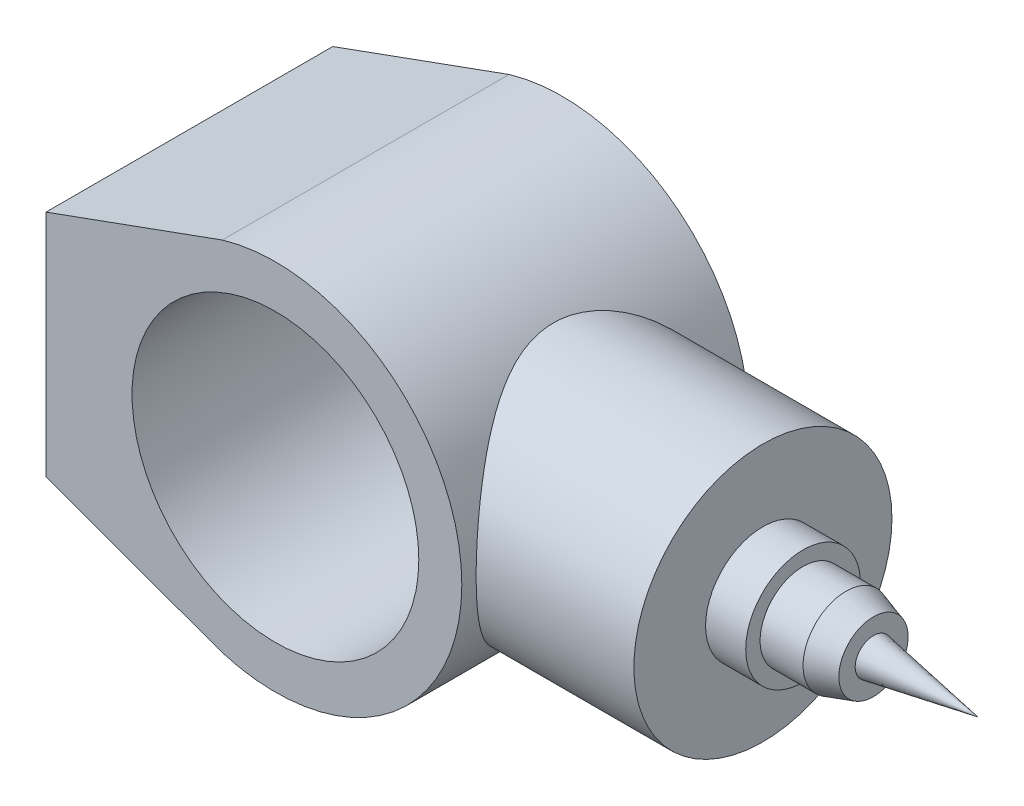
ISO-10303-21;
HEADER;
FILE_DESCRIPTION(('STEP AP214'),'2;1');
FILE_NAME('part.step','',(''),(''),'','','');
FILE_SCHEMA(('AUTOMOTIVE_DESIGN { 1 0 10303 214 1 1 1 1 }'));
ENDSEC;
DATA;
#1=APPLICATION_CONTEXT('core data for automotive mechanical design processes');
#2=APPLICATION_PROTOCOL_DEFINITION('international standard','automotive_design',2000,#1);
#3=PRODUCT_CONTEXT('',#1,'mechanical');
#4=PRODUCT('Part','Part','',(#3));
#5=PRODUCT_RELATED_PRODUCT_CATEGORY('part','',(#4));
#6=PRODUCT_DEFINITION_FORMATION('','',#4);
#7=PRODUCT_DEFINITION_CONTEXT('part definition',#1,'design');
#8=PRODUCT_DEFINITION('design','',#6,#7);
#9=PRODUCT_DEFINITION_SHAPE('','',#8);
#10=(LENGTH_UNIT() NAMED_UNIT(*) SI_UNIT(.MILLI.,.METRE.));
#11=(NAMED_UNIT(*) PLANE_ANGLE_UNIT() SI_UNIT($,.RADIAN.));
#12=(NAMED_UNIT(*) SI_UNIT($,.STERADIAN.) SOLID_ANGLE_UNIT());
#13=UNCERTAINTY_MEASURE_WITH_UNIT(LENGTH_MEASURE(1.E-05),#10,'distance_accuracy_value','');
#14=(GEOMETRIC_REPRESENTATION_CONTEXT(3) GLOBAL_UNCERTAINTY_ASSIGNED_CONTEXT((#13)) GLOBAL_UNIT_ASSIGNED_CONTEXT((#10,
#11,#12)) REPRESENTATION_CONTEXT('',''));
#15=CARTESIAN_POINT('',(0.,0.,0.));
#16=DIRECTION('',(0.,0.,1.));
#17=DIRECTION('',(1.,0.,0.));
#18=AXIS2_PLACEMENT_3D('',#15,#16,#17);
#19=CARTESIAN_POINT('',(0.,0.,50.));
#20=DIRECTION('',(0.,0.,1.));
#21=DIRECTION('',(1.,0.,0.));
#22=AXIS2_PLACEMENT_3D('',#19,#20,#21);
#23=PLANE('',#22);
#24=DIRECTION('',(-0.940044222342616,-0.341052576650971,0.));
#25=VECTOR('',#24,1.);
#26=CARTESIAN_POINT('',(-80.,40.,50.));
#27=LINE('',#26,#25);
#28=CARTESIAN_POINT('',(-18.5118551653975,62.3081954347528,50.));
#29=VERTEX_POINT('',#28);
#30=CARTESIAN_POINT('',(-80.,40.,50.));
#31=VERTEX_POINT('',#30);
#32=EDGE_CURVE('E182',#29,#31,#27,.T.);
#33=ORIENTED_EDGE('',*,*,#32,.T.);
#34=DIRECTION('',(0.,-1.,0.));
#35=VECTOR('',#34,1.);
#36=CARTESIAN_POINT('',(-80.,-40.,50.));
#37=LINE('',#36,#35);
#38=CARTESIAN_POINT('',(-80.,-40.,50.));
#39=VERTEX_POINT('',#38);
#40=EDGE_CURVE('E84',#31,#39,#37,.T.);
#41=ORIENTED_EDGE('',*,*,#40,.T.);
#42=DIRECTION('',(0.940044222342616,-0.341052576650971,0.));
#43=VECTOR('',#42,1.);
#44=CARTESIAN_POINT('',(-80.,-40.,50.));
#45=LINE('',#44,#43);
#46=CARTESIAN_POINT('',(-18.5118551653975,-62.3081954347528,50.));
#47=VERTEX_POINT('',#46);
#48=EDGE_CURVE('E178',#39,#47,#45,.T.);
#49=ORIENTED_EDGE('',*,*,#48,.T.);
#50=CARTESIAN_POINT('',(0.,0.,50.));
#51=DIRECTION('',(0.,0.,1.));
#52=DIRECTION('',(1.,0.,0.));
#53=AXIS2_PLACEMENT_3D('',#50,#51,#52);
#54=CIRCLE('',#53,65.);
#55=EDGE_CURVE('E53',#47,#29,#54,.T.);
#56=ORIENTED_EDGE('',*,*,#55,.T.);
#57=EDGE_LOOP('',(#33,#41,#49,#56));
#58=FACE_BOUND('',#57,.T.);
#59=CARTESIAN_POINT('',(0.,0.,50.));
#60=DIRECTION('',(0.,0.,1.));
#61=DIRECTION('',(1.,0.,0.));
#62=AXIS2_PLACEMENT_3D('',#59,#60,#61);
#63=CIRCLE('',#62,50.);
#64=CARTESIAN_POINT('',(50.,0.,50.));
#65=VERTEX_POINT('',#64);
#66=EDGE_CURVE('E192',#65,#65,#63,.T.);
#67=ORIENTED_EDGE('',*,*,#66,.F.);
#68=EDGE_LOOP('',(#67));
#69=FACE_BOUND('',#68,.T.);
#70=ADVANCED_FACE('F36',(#58,#69),#23,.T.);
#71=CARTESIAN_POINT('',(0.,0.,-50.));
#72=DIRECTION('',(0.,0.,1.));
#73=DIRECTION('',(1.,0.,0.));
#74=AXIS2_PLACEMENT_3D('',#71,#72,#73);
#75=PLANE('',#74);
#76=DIRECTION('',(-0.940044222342616,-0.341052576650971,0.));
#77=VECTOR('',#76,1.);
#78=CARTESIAN_POINT('',(-80.,40.,-50.));
#79=LINE('',#78,#77);
#80=CARTESIAN_POINT('',(-18.5118551653975,62.3081954347528,-50.));
#81=VERTEX_POINT('',#80);
#82=CARTESIAN_POINT('',(-80.,40.,-50.));
#83=VERTEX_POINT('',#82);
#84=EDGE_CURVE('E176',#81,#83,#79,.T.);
#85=ORIENTED_EDGE('',*,*,#84,.F.);
#86=CARTESIAN_POINT('',(0.,0.,-50.));
#87=DIRECTION('',(0.,0.,1.));
#88=DIRECTION('',(1.,0.,0.));
#89=AXIS2_PLACEMENT_3D('',#86,#87,#88);
#90=CIRCLE('',#89,65.);
#91=CARTESIAN_POINT('',(-18.5118551653975,-62.3081954347528,-50.));
#92=VERTEX_POINT('',#91);
#93=EDGE_CURVE('E77',#92,#81,#90,.T.);
#94=ORIENTED_EDGE('',*,*,#93,.F.);
#95=DIRECTION('',(0.940044222342616,-0.341052576650971,0.));
#96=VECTOR('',#95,1.);
#97=CARTESIAN_POINT('',(-80.,-40.,-50.));
#98=LINE('',#97,#96);
#99=CARTESIAN_POINT('',(-80.,-40.,-50.));
#100=VERTEX_POINT('',#99);
#101=EDGE_CURVE('E71',#100,#92,#98,.T.);
#102=ORIENTED_EDGE('',*,*,#101,.F.);
#103=DIRECTION('',(0.,-1.,0.));
#104=VECTOR('',#103,1.);
#105=CARTESIAN_POINT('',(-80.,-40.,-50.));
#106=LINE('',#105,#104);
#107=EDGE_CURVE('E171',#83,#100,#106,.T.);
#108=ORIENTED_EDGE('',*,*,#107,.F.);
#109=EDGE_LOOP('',(#85,#94,#102,#108));
#110=FACE_BOUND('',#109,.T.);
#111=CARTESIAN_POINT('',(0.,0.,-50.));
#112=DIRECTION('',(0.,0.,1.));
#113=DIRECTION('',(1.,0.,0.));
#114=AXIS2_PLACEMENT_3D('',#111,#112,#113);
#115=CIRCLE('',#114,50.);
#116=CARTESIAN_POINT('',(50.,0.,-50.));
#117=VERTEX_POINT('',#116);
#118=EDGE_CURVE('E194',#117,#117,#115,.T.);
#119=ORIENTED_EDGE('',*,*,#118,.T.);
#120=EDGE_LOOP('',(#119));
#121=FACE_BOUND('',#120,.T.);
#122=ADVANCED_FACE('F151',(#110,#121),#75,.F.);
#123=CARTESIAN_POINT('',(-80.,40.,50.));
#124=DIRECTION('',(0.341052576650971,-0.940044222342616,0.));
#125=DIRECTION('',(0.940044222342616,0.341052576650971,0.));
#126=AXIS2_PLACEMENT_3D('',#123,#124,#125);
#127=PLANE('',#126);
#128=ORIENTED_EDGE('',*,*,#84,.T.);
#129=DIRECTION('',(0.,0.,-1.));
#130=VECTOR('',#129,1.);
#131=CARTESIAN_POINT('',(-80.,40.,50.));
#132=LINE('',#131,#130);
#133=EDGE_CURVE('E11',#31,#83,#132,.T.);
#134=ORIENTED_EDGE('',*,*,#133,.F.);
#135=ORIENTED_EDGE('',*,*,#32,.F.);
#136=DIRECTION('',(0.,0.,-1.));
#137=VECTOR('',#136,1.);
#138=CARTESIAN_POINT('',(-18.5118551653975,62.3081954347528,50.));
#139=LINE('',#138,#137);
#140=EDGE_CURVE('E186',#29,#81,#139,.T.);
#141=ORIENTED_EDGE('',*,*,#140,.T.);
#142=EDGE_LOOP('',(#128,#134,#135,#141));
#143=FACE_BOUND('',#142,.T.);
#144=ADVANCED_FACE('F38',(#143),#127,.F.);
#145=CARTESIAN_POINT('',(-80.,-40.,50.));
#146=DIRECTION('',(1.,0.,0.));
#147=DIRECTION('',(0.,0.,-1.));
#148=AXIS2_PLACEMENT_3D('',#145,#146,#147);
#149=PLANE('',#148);
#150=ORIENTED_EDGE('',*,*,#107,.T.);
#151=DIRECTION('',(0.,0.,-1.));
#152=VECTOR('',#151,1.);
#153=CARTESIAN_POINT('',(-80.,-40.,50.));
#154=LINE('',#153,#152);
#155=EDGE_CURVE('E45',#39,#100,#154,.T.);
#156=ORIENTED_EDGE('',*,*,#155,.F.);
#157=ORIENTED_EDGE('',*,*,#40,.F.);
#158=ORIENTED_EDGE('',*,*,#133,.T.);
#159=EDGE_LOOP('',(#150,#156,#157,#158));
#160=FACE_BOUND('',#159,.T.);
#161=ADVANCED_FACE('F165',(#160),#149,.F.);
#162=CARTESIAN_POINT('',(-80.,-40.,50.));
#163=DIRECTION('',(0.341052576650971,0.940044222342616,0.));
#164=DIRECTION('',(-0.940044222342616,0.341052576650971,0.));
#165=AXIS2_PLACEMENT_3D('',#162,#163,#164);
#166=PLANE('',#165);
#167=ORIENTED_EDGE('',*,*,#101,.T.);
#168=DIRECTION('',(0.,0.,-1.));
#169=VECTOR('',#168,1.);
#170=CARTESIAN_POINT('',(-18.5118551653975,-62.3081954347528,50.));
#171=LINE('',#170,#169);
#172=EDGE_CURVE('E179',#47,#92,#171,.T.);
#173=ORIENTED_EDGE('',*,*,#172,.F.);
#174=ORIENTED_EDGE('',*,*,#48,.F.);
#175=ORIENTED_EDGE('',*,*,#155,.T.);
#176=EDGE_LOOP('',(#167,#173,#174,#175));
#177=FACE_BOUND('',#176,.T.);
#178=ADVANCED_FACE('F162',(#177),#166,.F.);
#179=CARTESIAN_POINT('',(0.,0.,50.));
#180=DIRECTION('',(0.,0.,-1.));
#181=DIRECTION('',(-1.,0.,0.));
#182=AXIS2_PLACEMENT_3D('',#179,#180,#181);
#183=CYLINDRICAL_SURFACE('',#182,65.);
#184=CARTESIAN_POINT('',(65.,0.,-45.));
#185=CARTESIAN_POINT('',(65.0000011696057,1.12147330120565,-45.0000012025283));
#186=CARTESIAN_POINT('',(64.9709159765212,2.24292945230778,-44.9580201602482));
#187=CARTESIAN_POINT('',(64.8553068641383,4.47658414079082,-44.790785609369));
#188=CARTESIAN_POINT('',(64.7687842573088,5.58878288911931,-44.6655340035371));
#189=CARTESIAN_POINT('',(64.5403785763001,7.79555151848628,-44.3336771879691));
#190=CARTESIAN_POINT('',(64.3984760503456,8.89011506447751,-44.1270433931238));
#191=CARTESIAN_POINT('',(64.0626457436966,11.0533096019768,-43.6354760134034));
#192=CARTESIAN_POINT('',(63.8687169569864,12.1219400915896,-43.3505409144375));
#193=CARTESIAN_POINT('',(63.4342222744662,14.2212125160505,-42.7078017297046));
#194=CARTESIAN_POINT('',(63.1938918545645,15.2520162370063,-42.3503651251477));
#195=CARTESIAN_POINT('',(62.6709259446924,17.2756280115286,-41.5659763086892));
#196=CARTESIAN_POINT('',(62.3882907364915,18.268436318107,-41.1390245597888));
#197=CARTESIAN_POINT('',(61.786108553932,20.2116697228795,-40.2199419970838));
#198=CARTESIAN_POINT('',(61.4665619062631,21.1620951960855,-39.7278117601444));
#199=CARTESIAN_POINT('',(60.7962171584065,23.0172309124314,-38.6825647509799));
#200=CARTESIAN_POINT('',(60.4454175300334,23.9219389167185,-38.1294449962195));
#201=CARTESIAN_POINT('',(59.6865648974474,25.7601880140228,-36.9151737617935));
#202=CARTESIAN_POINT('',(59.27618815402,26.6893215363404,-36.2488040005491));
#203=CARTESIAN_POINT('',(58.4330275057249,28.4880338622967,-34.8529502059224));
#204=CARTESIAN_POINT('',(58.0002425478181,29.3576098626539,-34.1234632053608));
#205=CARTESIAN_POINT('',(57.1195111836477,31.0364486388513,-32.6040251352403));
#206=CARTESIAN_POINT('',(56.6715447181891,31.8456267033451,-31.8139921794123));
#207=CARTESIAN_POINT('',(55.7691986061138,33.4006700551814,-30.1773036556993));
#208=CARTESIAN_POINT('',(55.3148185876119,34.1465316534289,-29.3306447936721));
#209=CARTESIAN_POINT('',(54.3303114345595,35.6959084068904,-27.4326466159468));
#210=CARTESIAN_POINT('',(53.8005937511269,36.4872853280241,-26.3711450656527));
#211=CARTESIAN_POINT('',(52.7593327891933,37.9773509509911,-24.17604025639));
#212=CARTESIAN_POINT('',(52.2477941160227,38.6760162868262,-23.0424189272517));
#213=CARTESIAN_POINT('',(51.2608149265043,39.9749077721744,-20.7072341856928));
#214=CARTESIAN_POINT('',(50.7853275075273,40.5752630453964,-19.5057627267967));
#215=CARTESIAN_POINT('',(49.8892399163793,41.6721166930025,-17.036931864064));
#216=CARTESIAN_POINT('',(49.4686114171658,42.1686687478853,-15.7696069409943));
#217=CARTESIAN_POINT('',(48.8208029416879,42.9149535309565,-13.5723996352816));
#218=CARTESIAN_POINT('',(48.5738420263557,43.1936925213245,-12.6581208440976));
#219=CARTESIAN_POINT('',(48.1238801744123,43.6944569649788,-10.8035389223551));
#220=CARTESIAN_POINT('',(47.9208721021929,43.9164916250901,-9.86324004407419));
#221=CARTESIAN_POINT('',(47.5660754926548,44.3005296261305,-7.96250438663409));
#222=CARTESIAN_POINT('',(47.4142038087044,44.4626304606427,-7.00210302149487));
#223=CARTESIAN_POINT('',(47.1671263845177,44.7246555122386,-5.06554052628518));
#224=CARTESIAN_POINT('',(47.0719206259529,44.824579749433,-4.08937940131224));
#225=CARTESIAN_POINT('',(46.9418899090943,44.9607388198673,-2.1232364847967));
#226=CARTESIAN_POINT('',(46.9073939345417,44.9966266570423,-1.13320851844658));
#227=CARTESIAN_POINT('',(46.9013571135476,45.0029190462422,0.847248377093852));
#228=CARTESIAN_POINT('',(46.9298161498631,44.9733237202183,1.837677305534));
#229=CARTESIAN_POINT('',(47.0484302849821,44.8492190899201,3.81128752429081));
#230=CARTESIAN_POINT('',(47.13862305521,44.7546701492421,4.79446401850661));
#231=CARTESIAN_POINT('',(47.3768313176079,44.5024241630868,6.74551496467455));
#232=CARTESIAN_POINT('',(47.5248480621437,44.3447257499009,7.71338908473168));
#233=CARTESIAN_POINT('',(47.8621764271841,43.9803320764262,9.56919366964684));
#234=CARTESIAN_POINT('',(48.0484149088864,43.7772163066585,10.4583970625519));
#235=CARTESIAN_POINT('',(48.4609441046406,43.32010640119,12.2144143492181));
#236=CARTESIAN_POINT('',(48.6872496045115,43.0660934784815,13.0812198417583));
#237=CARTESIAN_POINT('',(49.1738509640383,42.5096331932465,14.7898225666927));
#238=CARTESIAN_POINT('',(49.4341648638834,42.2071601049958,15.6316062329481));
#239=CARTESIAN_POINT('',(49.9825182796335,41.5563350032134,17.2876417419013));
#240=CARTESIAN_POINT('',(50.2705534011697,41.2079902580444,18.1018979206949));
#241=CARTESIAN_POINT('',(51.0225431471345,40.2767822129268,20.1137766396802));
#242=CARTESIAN_POINT('',(51.5007434523328,39.6654891440572,21.2930273345177));
#243=CARTESIAN_POINT('',(52.4891158781477,38.348029920852,23.5833678403921));
#244=CARTESIAN_POINT('',(52.9993005340589,37.6418264436726,24.6944305853524));
#245=CARTESIAN_POINT('',(54.0361557973494,36.1376496350166,26.8476775780095));
#246=CARTESIAN_POINT('',(54.5628535785461,35.3395185623559,27.8897384505711));
#247=CARTESIAN_POINT('',(55.6171804467178,33.6558443419671,29.8998791095632));
#248=CARTESIAN_POINT('',(56.1448094104418,32.7703120184234,30.8679680307498));
#249=CARTESIAN_POINT('',(57.1932449701135,30.9045304086319,32.7363921475659));
#250=CARTESIAN_POINT('',(57.7139191350983,29.9233731295192,33.6358963165067));
#251=CARTESIAN_POINT('',(58.7296419536465,27.8771206485979,35.350355349792));
#252=CARTESIAN_POINT('',(59.2246882700661,26.8120178135979,36.1653025097018));
#253=CARTESIAN_POINT('',(60.1756566955639,24.6035209522421,37.7024332048813));
#254=CARTESIAN_POINT('',(60.6316475651595,23.4602711709794,38.4247809320632));
#255=CARTESIAN_POINT('',(61.4931891608211,21.0989507187335,39.7703323765769));
#256=CARTESIAN_POINT('',(61.898755017873,19.8809026570889,40.3935658507715));
#257=CARTESIAN_POINT('',(62.5646802947783,17.6549035875762,41.4059204565395));
#258=CARTESIAN_POINT('',(62.8372982548467,16.6602403417733,41.8163120535009));
#259=CARTESIAN_POINT('',(63.3397164077328,14.6345031625144,42.5675669112335));
#260=CARTESIAN_POINT('',(63.569522535998,13.603434299959,42.9084398107234));
#261=CARTESIAN_POINT('',(63.9815049902596,11.5110112910016,43.5164676119118));
#262=CARTESIAN_POINT('',(64.1637052650743,10.4496726714621,43.7836595836378));
#263=CARTESIAN_POINT('',(64.476639865795,8.30296993183371,44.2409869387356));
#264=CARTESIAN_POINT('',(64.6073730982257,7.21760530180254,44.431120684921));
#265=CARTESIAN_POINT('',(64.8147345736682,5.02649787175023,44.7321113931983));
#266=CARTESIAN_POINT('',(64.8911534961694,3.92069290489763,44.8426616714377));
#267=CARTESIAN_POINT('',(64.9872183357685,1.70145350776208,44.981563734156));
#268=CARTESIAN_POINT('',(65.0068642771874,0.588019080747696,45.0099155538474));
#269=CARTESIAN_POINT('',(64.9889001241945,-1.63741781931566,44.9839662509349));
#270=CARTESIAN_POINT('',(64.9512898349751,-2.74942028747967,44.929664847113));
#271=CARTESIAN_POINT('',(64.819734418053,-4.96298947367603,44.7392747901952));
#272=CARTESIAN_POINT('',(64.7257910494465,-6.06455651648127,44.6031886909653));
#273=CARTESIAN_POINT('',(64.491175703309,-8.18254449212149,44.2620157992034));
#274=CARTESIAN_POINT('',(64.3536808680178,-9.20007959997774,44.0616107864454));
#275=CARTESIAN_POINT('',(64.0337856060908,-11.2121337136589,43.5930613516679));
#276=CARTESIAN_POINT('',(63.8513873855499,-12.2066538475799,43.3249202574929));
#277=CARTESIAN_POINT('',(63.4451725249075,-14.1673074608523,42.7239854011605));
#278=CARTESIAN_POINT('',(63.2213525684632,-15.1334386601223,42.3911864622047));
#279=CARTESIAN_POINT('',(62.736336352677,-17.0327019487273,41.6643868113868));
#280=CARTESIAN_POINT('',(62.4751380044848,-17.965832190203,41.2703826790343));
#281=CARTESIAN_POINT('',(61.8990085085122,-19.8637431772395,40.3931275129008));
#282=CARTESIAN_POINT('',(61.5815209528501,-20.8256806929253,39.9054081529014));
#283=CARTESIAN_POINT('',(60.9142086391395,-22.7035764997345,38.8677076181211));
#284=CARTESIAN_POINT('',(60.5643826081083,-23.6195329786528,38.3177239921568));
#285=CARTESIAN_POINT('',(59.8381347129401,-25.4032558353403,37.1592008079418));
#286=CARTESIAN_POINT('',(59.4616987975441,-26.270996314329,36.5506302507532));
#287=CARTESIAN_POINT('',(58.6884577670336,-27.9557544991496,35.2787474176625));
#288=CARTESIAN_POINT('',(58.2916515549571,-28.7727694681138,34.6154321925309));
#289=CARTESIAN_POINT('',(57.4151711853793,-30.4889708749912,33.1199200847161));
#290=CARTESIAN_POINT('',(56.9328754552547,-31.3785212006928,32.2781812569548));
#291=CARTESIAN_POINT('',(55.9590893109094,-33.0839042215169,30.5278352445589));
#292=CARTESIAN_POINT('',(55.4675975421249,-33.8997259516808,29.6192181500899));
#293=CARTESIAN_POINT('',(54.4860350387397,-35.45586994741,27.7375714933993));
#294=CARTESIAN_POINT('',(53.9959654596117,-36.1961418986443,26.7644997080007));
#295=CARTESIAN_POINT('',(53.0294834997435,-37.5978502361011,24.7568233036382));
#296=CARTESIAN_POINT('',(52.553069328415,-38.2592969946585,23.7222268074148));
#297=CARTESIAN_POINT('',(51.679941347726,-39.4291013564639,21.7149007388747));
#298=CARTESIAN_POINT('',(51.2803372484816,-39.9463152685162,20.7485884228094));
#299=CARTESIAN_POINT('',(50.5123974548912,-40.9130636661729,18.7705314851885));
#300=CARTESIAN_POINT('',(50.1440619804653,-41.3625976757848,17.7587865441704));
#301=CARTESIAN_POINT('',(49.4504928922364,-42.1893301292689,15.693797265063));
#302=CARTESIAN_POINT('',(49.1251906412473,-42.566644202947,14.6406225749502));
#303=CARTESIAN_POINT('',(48.5290098021012,-43.2451098617227,12.4950157035289));
#304=CARTESIAN_POINT('',(48.2581179989952,-43.5462799449171,11.4025931307277));
#305=CARTESIAN_POINT('',(47.8271610412375,-44.0186874861181,9.3921629994351));
#306=CARTESIAN_POINT('',(47.6558419905218,-44.2036946073207,8.47979353570419));
#307=CARTESIAN_POINT('',(47.3627606953031,-44.517583244497,6.63757582668245));
#308=CARTESIAN_POINT('',(47.2409923142224,-44.6464717105955,5.70772976070373));
#309=CARTESIAN_POINT('',(47.05166615705,-44.8459556683364,3.83718735816971));
#310=CARTESIAN_POINT('',(46.9840561376509,-44.9166073394187,2.89650236820514));
#311=CARTESIAN_POINT('',(46.9055698265682,-44.9985645522097,1.01014116515035));
#312=CARTESIAN_POINT('',(46.894694331428,-45.0098692606967,0.0644648821697862));
#313=CARTESIAN_POINT('',(46.9301408777119,-44.972908524549,-1.82506201386804));
#314=CARTESIAN_POINT('',(46.9764888551696,-44.9246160680299,-2.76891160474201));
#315=CARTESIAN_POINT('',(47.1245232303033,-44.7693052695385,-4.64731891289862));
#316=CARTESIAN_POINT('',(47.226209296244,-44.6622872796082,-5.58187668584874));
#317=CARTESIAN_POINT('',(47.4811423262629,-44.3911660407895,-7.43666598606561));
#318=CARTESIAN_POINT('',(47.634452919394,-44.2269923369625,-8.35687836049678));
#319=CARTESIAN_POINT('',(47.9871889035597,-43.8440109221367,-10.1768310643423));
#320=CARTESIAN_POINT('',(48.1866204648689,-43.6251959006593,-11.0765686368372));
#321=CARTESIAN_POINT('',(48.6908782922366,-43.0625185245671,-13.116726178063));
#322=CARTESIAN_POINT('',(49.0093972350599,-42.7008255731353,-14.2488681052183));
#323=CARTESIAN_POINT('',(49.699554494161,-41.8955268796886,-16.4668795226373));
#324=CARTESIAN_POINT('',(50.0712093704162,-41.4518955887103,-17.5527344499461));
#325=CARTESIAN_POINT('',(50.8544123719762,-40.4872212981013,-19.6760329984318));
#326=CARTESIAN_POINT('',(51.2660067549033,-39.9660881554129,-20.7134183727638));
#327=CARTESIAN_POINT('',(52.116211879306,-38.8508952329155,-22.7363587217865));
#328=CARTESIAN_POINT('',(52.5548209260535,-38.2568400254561,-23.7219169406072));
#329=CARTESIAN_POINT('',(53.4579357785502,-36.9847423381263,-25.6613286822633));
#330=CARTESIAN_POINT('',(53.9228021101371,-36.3051118639051,-26.6139712103077));
#331=CARTESIAN_POINT('',(54.8583333343946,-34.8753950985048,-28.4617532840731));
#332=CARTESIAN_POINT('',(55.3289982185488,-34.1253089107936,-29.3568929142368));
#333=CARTESIAN_POINT('',(56.2664339133503,-32.5564691651912,-31.0876310121466));
#334=CARTESIAN_POINT('',(56.7332035093429,-31.7376950080829,-31.923211478402));
#335=CARTESIAN_POINT('',(57.6535165855435,-30.033481652025,-33.5315189390535));
#336=CARTESIAN_POINT('',(58.1070588196762,-29.1480362003111,-34.3042400240121));
#337=CARTESIAN_POINT('',(59.0635284336244,-27.1643113596245,-35.9022819462667));
#338=CARTESIAN_POINT('',(59.5626106290919,-26.0547472869609,-36.7159606163356));
#339=CARTESIAN_POINT('',(60.5176757229357,-23.7521280348398,-38.2458641369291));
#340=CARTESIAN_POINT('',(60.9736519283074,-22.5590599397198,-38.962073861155));
#341=CARTESIAN_POINT('',(61.6149926579414,-20.7127348127311,-39.9558623322098));
#342=CARTESIAN_POINT('',(61.8215919655179,-20.088110583999,-40.2735888165198));
#343=CARTESIAN_POINT('',(62.2191547005856,-18.8206694867556,-40.8812436548858));
#344=CARTESIAN_POINT('',(62.4101203779565,-18.1778552539997,-41.1711760099034));
#345=CARTESIAN_POINT('',(62.7748527233683,-16.875283117665,-41.7219931318356));
#346=CARTESIAN_POINT('',(62.9486230408552,-16.2155288469421,-41.9828840638124));
#347=CARTESIAN_POINT('',(63.2775356475737,-14.8804011558233,-42.4744610119283));
#348=CARTESIAN_POINT('',(63.432679284421,-14.2050288695917,-42.7051492133046));
#349=CARTESIAN_POINT('',(63.8070721968101,-12.4447010544915,-43.25974494481));
#350=CARTESIAN_POINT('',(64.0114184468014,-11.3490405228654,-43.5602757498286));
#351=CARTESIAN_POINT('',(64.3654191982087,-9.12991345978806,-44.078827644396));
#352=CARTESIAN_POINT('',(64.5150820049425,-8.00645117856259,-44.2968612637911));
#353=CARTESIAN_POINT('',(64.7559993187061,-5.74082253729113,-44.6470112993716));
#354=CARTESIAN_POINT('',(64.847297757104,-4.59867091062173,-44.7791923387443));
#355=CARTESIAN_POINT('',(64.9692976296881,-2.30434018473195,-44.9556862638234));
#356=CARTESIAN_POINT('',(64.9999987983895,-1.15216104160189,-44.999998764566));
#357=CARTESIAN_POINT('',(65.,0.,-45.));
#358=B_SPLINE_CURVE_WITH_KNOTS('',3,(#184,#185,#186,#187,#188,#189,#190,#191,#192,#193,#194,
#195,#196,#197,#198,#199,#200,#201,#202,#203,#204,#205,#206,#207,#208,#209,#210,#211,#212,#213,
#214,#215,#216,#217,#218,#219,#220,#221,#222,#223,#224,#225,#226,#227,#228,#229,#230,#231,#232,
#233,#234,#235,#236,#237,#238,#239,#240,#241,#242,#243,#244,#245,#246,#247,#248,#249,#250,#251,
#252,#253,#254,#255,#256,#257,#258,#259,#260,#261,#262,#263,#264,#265,#266,#267,#268,#269,#270,
#271,#272,#273,#274,#275,#276,#277,#278,#279,#280,#281,#282,#283,#284,#285,#286,#287,#288,#289,
#290,#291,#292,#293,#294,#295,#296,#297,#298,#299,#300,#301,#302,#303,#304,#305,#306,#307,#308,
#309,#310,#311,#312,#313,#314,#315,#316,#317,#318,#319,#320,#321,#322,#323,#324,#325,#326,#327,
#328,#329,#330,#331,#332,#333,#334,#335,#336,#337,#338,#339,#340,#341,#342,#343,#344,#345,#346,
#347,#348,#349,#350,#351,#352,#353,#354,#355,#356,#357),.UNSPECIFIED.,.T.,.F.,(4,2,2,2,2,2,2,2,
2,2,2,2,2,2,2,2,2,2,2,2,2,2,2,2,2,2,2,2,2,2,2,2,2,2,2,2,2,2,2,2,2,2,2,2,2,2,2,2,2,2,2,2,2,2,2,2,
2,2,2,2,2,2,2,2,2,2,2,2,2,2,2,2,2,2,2,2,2,2,2,2,2,2,2,2,2,2,4),(0.,3.36323892794144,
6.72640100710137,10.0907454360665,13.4551549250109,16.8029195613731,20.1506619010729,
23.4983746134034,26.8462511096753,30.4871649037346,34.1282499524345,37.7743494260164,
41.4206611917409,45.6939383064405,49.9682903731881,54.2369825353392,58.5034617073671,
61.4625138492405,64.4210852373372,67.3748225577202,70.3285589227263,73.2982527376573,
76.2679410220407,79.2394430998938,82.2110095388412,85.0011411726389,87.7923045951578,
90.584954683776,93.3771628083065,97.6064034875675,101.837312178738,106.075592113262,
110.313347816192,114.596218662803,118.879479402292,123.155037051935,127.429308626693,
130.755998382163,134.082226580387,137.406778235214,140.731400520075,144.068767009318,
147.406132068879,150.743508483461,154.080780688207,157.215791533369,160.350648386749,
163.485756334407,166.621039552604,169.990545063149,173.360183268584,176.73161428665,
180.103227050672,184.047902440152,187.993163521895,191.94103513809,195.888386692538,
199.385185586645,202.88200907258,206.373186157811,209.863514294626,212.700365177753,
215.536864625513,218.370624567028,221.204424293963,224.039508887241,226.874576485218,
229.713151272815,232.55210603787,236.23803941247,239.925124033801,243.616531168718,
247.307706963636,251.081871120678,254.856029735252,258.631324277359,262.406973327354,
266.792058434818,271.177823293658,273.368885604935,275.55963203795,277.749912517597,
279.940034437727,283.398420446896,286.856280978073,290.31153567335,293.766805506531),.UNSPECIFIED.);
#359=CARTESIAN_POINT('',(65.,0.,-45.));
#360=VERTEX_POINT('',#359);
#361=EDGE_CURVE('E117',#360,#360,#358,.T.);
#362=ORIENTED_EDGE('',*,*,#361,.F.);
#363=EDGE_LOOP('',(#362));
#364=FACE_BOUND('',#363,.T.);
#365=ORIENTED_EDGE('',*,*,#93,.T.);
#366=ORIENTED_EDGE('',*,*,#140,.F.);
#367=ORIENTED_EDGE('',*,*,#55,.F.);
#368=ORIENTED_EDGE('',*,*,#172,.T.);
#369=EDGE_LOOP('',(#365,#366,#367,#368));
#370=FACE_BOUND('',#369,.T.);
#371=ADVANCED_FACE('F148',(#364,#370),#183,.T.);
#372=CARTESIAN_POINT('',(0.,0.,50.));
#373=DIRECTION('',(0.,0.,-1.));
#374=DIRECTION('',(-1.,0.,0.));
#375=AXIS2_PLACEMENT_3D('',#372,#373,#374);
#376=CYLINDRICAL_SURFACE('',#375,50.);
#377=ORIENTED_EDGE('',*,*,#66,.T.);
#378=EDGE_LOOP('',(#377));
#379=FACE_BOUND('',#378,.T.);
#380=ORIENTED_EDGE('',*,*,#118,.F.);
#381=EDGE_LOOP('',(#380));
#382=FACE_BOUND('',#381,.T.);
#383=ADVANCED_FACE('F138',(#379,#382),#376,.F.);
#384=CARTESIAN_POINT('',(-80.002,0.,0.));
#385=DIRECTION('',(1.,0.,0.));
#386=DIRECTION('',(0.,0.,-1.));
#387=AXIS2_PLACEMENT_3D('',#384,#385,#386);
#388=CYLINDRICAL_SURFACE('',#387,45.);
#389=CARTESIAN_POINT('',(120.,0.,0.));
#390=DIRECTION('',(1.,0.,0.));
#391=DIRECTION('',(0.,0.,-1.));
#392=AXIS2_PLACEMENT_3D('',#389,#390,#391);
#393=CIRCLE('',#392,45.);
#394=CARTESIAN_POINT('',(120.,0.,-45.));
#395=VERTEX_POINT('',#394);
#396=EDGE_CURVE('E125',#395,#395,#393,.T.);
#397=ORIENTED_EDGE('',*,*,#396,.F.);
#398=EDGE_LOOP('',(#397));
#399=FACE_BOUND('',#398,.T.);
#400=ORIENTED_EDGE('',*,*,#361,.T.);
#401=EDGE_LOOP('',(#400));
#402=FACE_BOUND('',#401,.T.);
#403=ADVANCED_FACE('F127',(#399,#402),#388,.T.);
#404=CARTESIAN_POINT('',(120.,0.,0.));
#405=DIRECTION('',(1.,0.,0.));
#406=DIRECTION('',(0.,0.,-1.));
#407=AXIS2_PLACEMENT_3D('',#404,#405,#406);
#408=PLANE('',#407);
#409=CARTESIAN_POINT('',(120.,0.,0.));
#410=DIRECTION('',(-1.,0.,0.));
#411=DIRECTION('',(0.,0.,1.));
#412=AXIS2_PLACEMENT_3D('',#409,#410,#411);
#413=CIRCLE('',#412,20.);
#414=CARTESIAN_POINT('',(120.,0.,20.));
#415=VERTEX_POINT('',#414);
#416=EDGE_CURVE('E114',#415,#415,#413,.T.);
#417=ORIENTED_EDGE('',*,*,#416,.T.);
#418=EDGE_LOOP('',(#417));
#419=FACE_BOUND('',#418,.T.);
#420=ORIENTED_EDGE('',*,*,#396,.T.);
#421=EDGE_LOOP('',(#420));
#422=FACE_BOUND('',#421,.T.);
#423=ADVANCED_FACE('F135',(#419,#422),#408,.T.);
#424=CARTESIAN_POINT('',(0.,0.,0.));
#425=DIRECTION('',(-1.,0.,0.));
#426=DIRECTION('',(0.,0.,1.));
#427=AXIS2_PLACEMENT_3D('',#424,#425,#426);
#428=CYLINDRICAL_SURFACE('',#427,20.);
#429=CARTESIAN_POINT('',(134.,0.,0.));
#430=DIRECTION('',(-1.,0.,0.));
#431=DIRECTION('',(0.,0.,1.));
#432=AXIS2_PLACEMENT_3D('',#429,#430,#431);
#433=CIRCLE('',#432,20.);
#434=CARTESIAN_POINT('',(134.,0.,20.));
#435=VERTEX_POINT('',#434);
#436=EDGE_CURVE('E111',#435,#435,#433,.T.);
#437=ORIENTED_EDGE('',*,*,#436,.T.);
#438=EDGE_LOOP('',(#437));
#439=FACE_BOUND('',#438,.T.);
#440=ORIENTED_EDGE('',*,*,#416,.F.);
#441=EDGE_LOOP('',(#440));
#442=FACE_BOUND('',#441,.T.);
#443=ADVANCED_FACE('F133',(#439,#442),#428,.T.);
#444=CARTESIAN_POINT('',(134.,-20.,0.));
#445=DIRECTION('',(1.,0.,0.));
#446=DIRECTION('',(0.,0.,-1.));
#447=AXIS2_PLACEMENT_3D('',#444,#445,#446);
#448=PLANE('',#447);
#449=CARTESIAN_POINT('',(134.,0.,0.));
#450=DIRECTION('',(-1.,0.,0.));
#451=DIRECTION('',(0.,0.,1.));
#452=AXIS2_PLACEMENT_3D('',#449,#450,#451);
#453=CIRCLE('',#452,15.);
#454=CARTESIAN_POINT('',(134.,0.,15.));
#455=VERTEX_POINT('',#454);
#456=EDGE_CURVE('E108',#455,#455,#453,.T.);
#457=ORIENTED_EDGE('',*,*,#456,.T.);
#458=EDGE_LOOP('',(#457));
#459=FACE_BOUND('',#458,.T.);
#460=ORIENTED_EDGE('',*,*,#436,.F.);
#461=EDGE_LOOP('',(#460));
#462=FACE_BOUND('',#461,.T.);
#463=ADVANCED_FACE('F143',(#459,#462),#448,.T.);
#464=CARTESIAN_POINT('',(0.,0.,0.));
#465=DIRECTION('',(-1.,0.,0.));
#466=DIRECTION('',(0.,0.,1.));
#467=AXIS2_PLACEMENT_3D('',#464,#465,#466);
#468=CYLINDRICAL_SURFACE('',#467,15.);
#469=CARTESIAN_POINT('',(149.,0.,0.));
#470=DIRECTION('',(-1.,0.,0.));
#471=DIRECTION('',(0.,0.,1.));
#472=AXIS2_PLACEMENT_3D('',#469,#470,#471);
#473=CIRCLE('',#472,15.);
#474=CARTESIAN_POINT('',(149.,0.,15.));
#475=VERTEX_POINT('',#474);
#476=EDGE_CURVE('E105',#475,#475,#473,.T.);
#477=ORIENTED_EDGE('',*,*,#476,.T.);
#478=EDGE_LOOP('',(#477));
#479=FACE_BOUND('',#478,.T.);
#480=ORIENTED_EDGE('',*,*,#456,.F.);
#481=EDGE_LOOP('',(#480));
#482=FACE_BOUND('',#481,.T.);
#483=ADVANCED_FACE('F263',(#479,#482),#468,.T.);
#484=CARTESIAN_POINT('',(149.,-15.,0.));
#485=DIRECTION('',(-1.,0.,0.));
#486=DIRECTION('',(0.,0.,1.));
#487=AXIS2_PLACEMENT_3D('',#484,#485,#486);
#488=PLANE('',#487);
#489=CARTESIAN_POINT('',(149.,0.,0.));
#490=DIRECTION('',(-1.,0.,0.));
#491=DIRECTION('',(0.,0.,1.));
#492=AXIS2_PLACEMENT_3D('',#489,#490,#491);
#493=CIRCLE('',#492,15.0222276850702);
#494=CARTESIAN_POINT('',(149.,0.,15.0222276850702));
#495=VERTEX_POINT('',#494);
#496=EDGE_CURVE('E100',#495,#495,#493,.T.);
#497=ORIENTED_EDGE('',*,*,#496,.T.);
#498=EDGE_LOOP('',(#497));
#499=FACE_BOUND('',#498,.T.);
#500=ORIENTED_EDGE('',*,*,#476,.F.);
#501=EDGE_LOOP('',(#500));
#502=FACE_BOUND('',#501,.T.);
#503=ADVANCED_FACE('F272',(#499,#502),#488,.T.);
#504=CARTESIAN_POINT('',(149.,0.,0.));
#505=DIRECTION('',(-1.,0.,0.));
#506=DIRECTION('',(0.,0.,1.));
#507=AXIS2_PLACEMENT_3D('',#504,#505,#506);
#508=CONICAL_SURFACE('',#507,15.0222276850702,0.299264512567771);
#509=CARTESIAN_POINT('',(158.555535821133,0.,0.));
#510=DIRECTION('',(-1.,0.,0.));
#511=DIRECTION('',(0.,0.,1.));
#512=AXIS2_PLACEMENT_3D('',#509,#510,#511);
#513=CIRCLE('',#512,12.0740527969325);
#514=CARTESIAN_POINT('',(158.555535821133,0.,12.0740527969325));
#515=VERTEX_POINT('',#514);
#516=EDGE_CURVE('E97',#515,#515,#513,.T.);
#517=ORIENTED_EDGE('',*,*,#516,.T.);
#518=EDGE_LOOP('',(#517));
#519=FACE_BOUND('',#518,.T.);
#520=ORIENTED_EDGE('',*,*,#496,.F.);
#521=EDGE_LOOP('',(#520));
#522=FACE_BOUND('',#521,.T.);
#523=ADVANCED_FACE('F282',(#519,#522),#508,.T.);
#524=CARTESIAN_POINT('',(158.555535821133,-12.0740527969325,0.));
#525=DIRECTION('',(1.,0.,0.));
#526=DIRECTION('',(0.,0.,-1.));
#527=AXIS2_PLACEMENT_3D('',#524,#525,#526);
#528=PLANE('',#527);
#529=CARTESIAN_POINT('',(158.555535821133,0.,0.));
#530=DIRECTION('',(-1.,0.,0.));
#531=DIRECTION('',(0.,0.,1.));
#532=AXIS2_PLACEMENT_3D('',#529,#530,#531);
#533=CIRCLE('',#532,6.38756845092657);
#534=CARTESIAN_POINT('',(158.555535821133,0.,6.38756845092657));
#535=VERTEX_POINT('',#534);
#536=EDGE_CURVE('E95',#535,#535,#533,.T.);
#537=ORIENTED_EDGE('',*,*,#536,.T.);
#538=EDGE_LOOP('',(#537));
#539=FACE_BOUND('',#538,.T.);
#540=ORIENTED_EDGE('',*,*,#516,.F.);
#541=EDGE_LOOP('',(#540));
#542=FACE_BOUND('',#541,.T.);
#543=ADVANCED_FACE('F91',(#539,#542),#528,.T.);
#544=CARTESIAN_POINT('',(158.555535821133,0.,0.));
#545=DIRECTION('',(-1.,0.,0.));
#546=DIRECTION('',(0.,0.,1.));
#547=AXIS2_PLACEMENT_3D('',#544,#545,#546);
#548=CONICAL_SURFACE('',#547,6.38756845092657,0.173506226172048);
#549=CARTESIAN_POINT('',(195.,0.,0.));
#550=VERTEX_POINT('',#549);
#551=VERTEX_LOOP('',#550);
#552=FACE_BOUND('',#551,.T.);
#553=ORIENTED_EDGE('',*,*,#536,.F.);
#554=EDGE_LOOP('',(#553));
#555=FACE_BOUND('',#554,.T.);
#556=ADVANCED_FACE('F88',(#552,#555),#548,.T.);
#557=CLOSED_SHELL('',(#70,#122,#144,#161,#178,#371,#383,#403,#423,#443,#463,#483,#503,#523,#543,#556));
#558=MANIFOLD_SOLID_BREP('B2',#557);
#559=ADVANCED_BREP_SHAPE_REPRESENTATION('',(#18,#558),#14);
#560=SHAPE_DEFINITION_REPRESENTATION(#9,#559);
ENDSEC;
END-ISO-10303-21;
